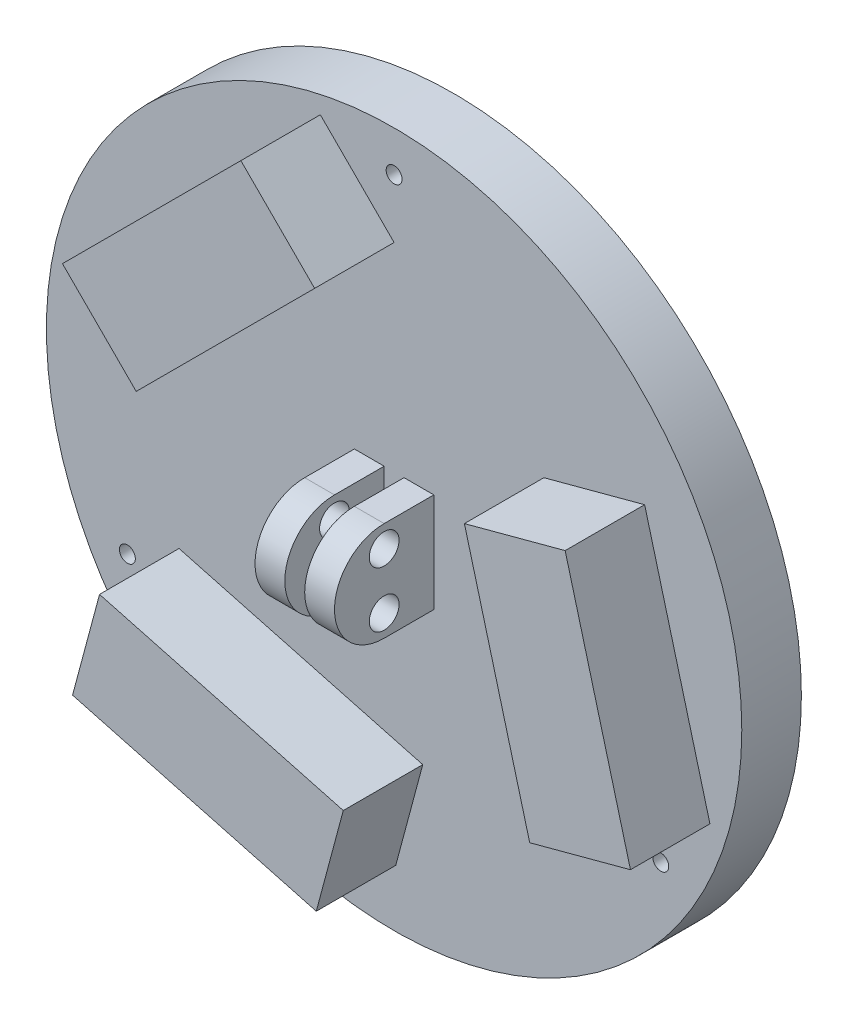
ISO-10303-21;
HEADER;
FILE_DESCRIPTION(('STEP AP214'),'2;1');
FILE_NAME('part.step','',(''),(''),'','','');
FILE_SCHEMA(('AUTOMOTIVE_DESIGN { 1 0 10303 214 1 1 1 1 }'));
ENDSEC;
DATA;
#1=APPLICATION_CONTEXT('core data for automotive mechanical design processes');
#2=APPLICATION_PROTOCOL_DEFINITION('international standard','automotive_design',2000,#1);
#3=PRODUCT_CONTEXT('',#1,'mechanical');
#4=PRODUCT('Part','Part','',(#3));
#5=PRODUCT_RELATED_PRODUCT_CATEGORY('part','',(#4));
#6=PRODUCT_DEFINITION_FORMATION('','',#4);
#7=PRODUCT_DEFINITION_CONTEXT('part definition',#1,'design');
#8=PRODUCT_DEFINITION('design','',#6,#7);
#9=PRODUCT_DEFINITION_SHAPE('','',#8);
#10=(LENGTH_UNIT() NAMED_UNIT(*) SI_UNIT(.MILLI.,.METRE.));
#11=(NAMED_UNIT(*) PLANE_ANGLE_UNIT() SI_UNIT($,.RADIAN.));
#12=(NAMED_UNIT(*) SI_UNIT($,.STERADIAN.) SOLID_ANGLE_UNIT());
#13=UNCERTAINTY_MEASURE_WITH_UNIT(LENGTH_MEASURE(1.E-05),#10,'distance_accuracy_value','');
#14=(GEOMETRIC_REPRESENTATION_CONTEXT(3) GLOBAL_UNCERTAINTY_ASSIGNED_CONTEXT((#13)) GLOBAL_UNIT_ASSIGNED_CONTEXT((#10,
#11,#12)) REPRESENTATION_CONTEXT('',''));
#15=CARTESIAN_POINT('',(0.,0.,0.));
#16=DIRECTION('',(0.,0.,1.));
#17=DIRECTION('',(1.,0.,0.));
#18=AXIS2_PLACEMENT_3D('',#15,#16,#17);
#19=CARTESIAN_POINT('',(0.,0.,6.));
#20=DIRECTION('',(0.,0.,1.));
#21=DIRECTION('',(1.,0.,0.));
#22=AXIS2_PLACEMENT_3D('',#19,#20,#21);
#23=PLANE('',#22);
#24=CARTESIAN_POINT('',(0.,0.,6.));
#25=DIRECTION('',(0.,0.,1.));
#26=DIRECTION('',(1.,0.,0.));
#27=AXIS2_PLACEMENT_3D('',#24,#25,#26);
#28=CIRCLE('',#27,0.6);
#29=CARTESIAN_POINT('',(0.6,0.,6.));
#30=VERTEX_POINT('',#29);
#31=EDGE_CURVE('E430',#30,#30,#28,.T.);
#32=ORIENTED_EDGE('',*,*,#31,.F.);
#33=EDGE_LOOP('',(#32));
#34=FACE_BOUND('',#33,.T.);
#35=CARTESIAN_POINT('',(1.34704405012329E-12,30.9142781849874,6.));
#36=DIRECTION('',(0.,0.,1.));
#37=DIRECTION('',(1.,0.,0.));
#38=AXIS2_PLACEMENT_3D('',#35,#36,#37);
#39=CIRCLE('',#38,0.799999999999999);
#40=CARTESIAN_POINT('',(0.800000000001346,30.9142781849874,6.));
#41=VERTEX_POINT('',#40);
#42=EDGE_CURVE('E443',#41,#41,#39,.T.);
#43=ORIENTED_EDGE('',*,*,#42,.F.);
#44=EDGE_LOOP('',(#43));
#45=FACE_BOUND('',#44,.T.);
#46=CARTESIAN_POINT('',(26.8467875173189,-15.5857218150126,6.));
#47=DIRECTION('',(0.,0.,1.));
#48=DIRECTION('',(1.,0.,0.));
#49=AXIS2_PLACEMENT_3D('',#46,#47,#48);
#50=CIRCLE('',#49,0.799999999999999);
#51=CARTESIAN_POINT('',(27.6467875173189,-15.5857218150126,6.));
#52=VERTEX_POINT('',#51);
#53=EDGE_CURVE('E447',#52,#52,#50,.T.);
#54=ORIENTED_EDGE('',*,*,#53,.F.);
#55=EDGE_LOOP('',(#54));
#56=FACE_BOUND('',#55,.T.);
#57=CARTESIAN_POINT('',(-26.8467875173163,-15.5857218150126,6.));
#58=DIRECTION('',(0.,0.,1.));
#59=DIRECTION('',(1.,0.,0.));
#60=AXIS2_PLACEMENT_3D('',#57,#58,#59);
#61=CIRCLE('',#60,0.799999999999999);
#62=CARTESIAN_POINT('',(-26.0467875173163,-15.5857218150126,6.));
#63=VERTEX_POINT('',#62);
#64=EDGE_CURVE('E455',#63,#63,#61,.T.);
#65=ORIENTED_EDGE('',*,*,#64,.F.);
#66=EDGE_LOOP('',(#65));
#67=FACE_BOUND('',#66,.T.);
#68=CARTESIAN_POINT('',(0.,0.,6.));
#69=DIRECTION('',(0.,0.,1.));
#70=DIRECTION('',(1.,0.,0.));
#71=AXIS2_PLACEMENT_3D('',#68,#69,#70);
#72=CIRCLE('',#71,35.);
#73=CARTESIAN_POINT('',(35.,0.,6.));
#74=VERTEX_POINT('',#73);
#75=EDGE_CURVE('E12',#74,#74,#72,.T.);
#76=ORIENTED_EDGE('',*,*,#75,.T.);
#77=EDGE_LOOP('',(#76));
#78=FACE_BOUND('',#77,.T.);
#79=DIRECTION('',(1.,0.,0.));
#80=VECTOR('',#79,1.);
#81=CARTESIAN_POINT('',(1.,-5.,6.));
#82=LINE('',#81,#80);
#83=CARTESIAN_POINT('',(1.,-5.,6.));
#84=VERTEX_POINT('',#83);
#85=CARTESIAN_POINT('',(4.,-5.,6.));
#86=VERTEX_POINT('',#85);
#87=EDGE_CURVE('E406',#84,#86,#82,.T.);
#88=ORIENTED_EDGE('',*,*,#87,.F.);
#89=DIRECTION('',(0.,-1.,0.));
#90=VECTOR('',#89,1.);
#91=CARTESIAN_POINT('',(0.999999999999999,5.,6.));
#92=LINE('',#91,#90);
#93=CARTESIAN_POINT('',(0.999999999999999,5.,6.));
#94=VERTEX_POINT('',#93);
#95=EDGE_CURVE('E402',#94,#84,#92,.T.);
#96=ORIENTED_EDGE('',*,*,#95,.F.);
#97=DIRECTION('',(-1.,0.,0.));
#98=VECTOR('',#97,1.);
#99=CARTESIAN_POINT('',(0.999999999999999,5.,6.));
#100=LINE('',#99,#98);
#101=CARTESIAN_POINT('',(4.,5.,6.));
#102=VERTEX_POINT('',#101);
#103=EDGE_CURVE('E414',#102,#94,#100,.T.);
#104=ORIENTED_EDGE('',*,*,#103,.F.);
#105=DIRECTION('',(0.,1.,0.));
#106=VECTOR('',#105,1.);
#107=CARTESIAN_POINT('',(4.,5.,6.));
#108=LINE('',#107,#106);
#109=EDGE_CURVE('E410',#86,#102,#108,.T.);
#110=ORIENTED_EDGE('',*,*,#109,.F.);
#111=EDGE_LOOP('',(#88,#96,#104,#110));
#112=FACE_BOUND('',#111,.T.);
#113=DIRECTION('',(-1.,0.,0.));
#114=VECTOR('',#113,1.);
#115=CARTESIAN_POINT('',(-1.,5.,6.));
#116=LINE('',#115,#114);
#117=CARTESIAN_POINT('',(-1.,5.,6.));
#118=VERTEX_POINT('',#117);
#119=CARTESIAN_POINT('',(-4.,5.,6.));
#120=VERTEX_POINT('',#119);
#121=EDGE_CURVE('E394',#118,#120,#116,.T.);
#122=ORIENTED_EDGE('',*,*,#121,.F.);
#123=DIRECTION('',(0.,1.,0.));
#124=VECTOR('',#123,1.);
#125=CARTESIAN_POINT('',(-1.,5.,6.));
#126=LINE('',#125,#124);
#127=CARTESIAN_POINT('',(-0.999999999999999,-5.,6.));
#128=VERTEX_POINT('',#127);
#129=EDGE_CURVE('E398',#128,#118,#126,.T.);
#130=ORIENTED_EDGE('',*,*,#129,.F.);
#131=DIRECTION('',(1.,0.,0.));
#132=VECTOR('',#131,1.);
#133=CARTESIAN_POINT('',(-0.999999999999999,-5.,6.));
#134=LINE('',#133,#132);
#135=CARTESIAN_POINT('',(-4.,-5.,6.));
#136=VERTEX_POINT('',#135);
#137=EDGE_CURVE('E386',#136,#128,#134,.T.);
#138=ORIENTED_EDGE('',*,*,#137,.F.);
#139=DIRECTION('',(0.,-1.,0.));
#140=VECTOR('',#139,1.);
#141=CARTESIAN_POINT('',(-4.,5.,6.));
#142=LINE('',#141,#140);
#143=EDGE_CURVE('E390',#120,#136,#142,.T.);
#144=ORIENTED_EDGE('',*,*,#143,.F.);
#145=EDGE_LOOP('',(#122,#130,#138,#144));
#146=FACE_BOUND('',#145,.T.);
#147=DIRECTION('',(0.707106781186544,-0.707106781186552,0.));
#148=VECTOR('',#147,1.);
#149=CARTESIAN_POINT('',(-25.3851334445971,14.4641089603206,6.));
#150=LINE('',#149,#148);
#151=CARTESIAN_POINT('',(-25.3851334445971,14.4641089603206,6.));
#152=VERTEX_POINT('',#151);
#153=CARTESIAN_POINT('',(-17.9605122421384,7.03948775786179,6.));
#154=VERTEX_POINT('',#153);
#155=EDGE_CURVE('E303',#152,#154,#150,.T.);
#156=ORIENTED_EDGE('',*,*,#155,.F.);
#157=DIRECTION('',(-0.707106781186562,-0.707106781186533,0.));
#158=VECTOR('',#157,1.);
#159=CARTESIAN_POINT('',(-7.42462120245843,32.4246212024585,6.));
#160=LINE('',#159,#158);
#161=CARTESIAN_POINT('',(-7.42462120245843,32.4246212024585,6.));
#162=VERTEX_POINT('',#161);
#163=EDGE_CURVE('E273',#162,#152,#160,.T.);
#164=ORIENTED_EDGE('',*,*,#163,.F.);
#165=DIRECTION('',(-0.707106781186544,0.707106781186552,0.));
#166=VECTOR('',#165,1.);
#167=CARTESIAN_POINT('',(-7.42462120245843,32.4246212024585,6.));
#168=LINE('',#167,#166);
#169=CARTESIAN_POINT('',(0.,25.,6.));
#170=VERTEX_POINT('',#169);
#171=EDGE_CURVE('E290',#170,#162,#168,.T.);
#172=ORIENTED_EDGE('',*,*,#171,.F.);
#173=DIRECTION('',(0.707106781186551,0.707106781186544,0.));
#174=VECTOR('',#173,1.);
#175=CARTESIAN_POINT('',(0.,25.,6.));
#176=LINE('',#175,#174);
#177=EDGE_CURVE('E306',#154,#170,#176,.T.);
#178=ORIENTED_EDGE('',*,*,#177,.F.);
#179=EDGE_LOOP('',(#156,#164,#172,#178));
#180=FACE_BOUND('',#179,.T.);
#181=DIRECTION('',(-0.96592582628907,-0.258819045102516,0.));
#182=VECTOR('',#181,1.);
#183=CARTESIAN_POINT('',(25.2188525250422,14.7521159613199,6.));
#184=LINE('',#183,#182);
#185=CARTESIAN_POINT('',(25.2188525250422,14.7521159613199,6.));
#186=VERTEX_POINT('',#185);
#187=CARTESIAN_POINT('',(15.076631349007,12.0345159877435,6.));
#188=VERTEX_POINT('',#187);
#189=EDGE_CURVE('E266',#186,#188,#184,.T.);
#190=ORIENTED_EDGE('',*,*,#189,.F.);
#191=DIRECTION('',(-0.258819045102516,0.96592582628907,0.));
#192=VECTOR('',#191,1.);
#193=CARTESIAN_POINT('',(31.7928562706461,-9.78240002642246,6.));
#194=LINE('',#193,#192);
#195=CARTESIAN_POINT('',(31.7928562706461,-9.78240002642246,6.));
#196=VERTEX_POINT('',#195);
#197=EDGE_CURVE('E269',#196,#186,#194,.T.);
#198=ORIENTED_EDGE('',*,*,#197,.F.);
#199=DIRECTION('',(0.96592582628907,0.258819045102515,0.));
#200=VECTOR('',#199,1.);
#201=CARTESIAN_POINT('',(31.7928562706461,-9.78240002642246,6.));
#202=LINE('',#201,#200);
#203=CARTESIAN_POINT('',(21.6506350946109,-12.4999999999989,6.));
#204=VERTEX_POINT('',#203);
#205=EDGE_CURVE('E259',#204,#196,#202,.T.);
#206=ORIENTED_EDGE('',*,*,#205,.F.);
#207=DIRECTION('',(0.258819045102516,-0.96592582628907,0.));
#208=VECTOR('',#207,1.);
#209=CARTESIAN_POINT('',(21.6506350946109,-12.4999999999989,6.));
#210=LINE('',#209,#208);
#211=EDGE_CURVE('E262',#188,#204,#210,.T.);
#212=ORIENTED_EDGE('',*,*,#211,.F.);
#213=EDGE_LOOP('',(#190,#198,#206,#212));
#214=FACE_BOUND('',#213,.T.);
#215=DIRECTION('',(0.258819045102526,0.965925826289067,0.));
#216=VECTOR('',#215,1.);
#217=CARTESIAN_POINT('',(0.166280919555753,-29.2162249216387,6.));
#218=LINE('',#217,#216);
#219=CARTESIAN_POINT('',(0.166280919555753,-29.2162249216387,6.));
#220=VERTEX_POINT('',#219);
#221=CARTESIAN_POINT('',(2.88388089313227,-19.0740037456035,6.));
#222=VERTEX_POINT('',#221);
#223=EDGE_CURVE('E228',#220,#222,#218,.T.);
#224=ORIENTED_EDGE('',*,*,#223,.F.);
#225=DIRECTION('',(0.965925826289067,-0.258819045102525,0.));
#226=VECTOR('',#225,1.);
#227=CARTESIAN_POINT('',(-24.3682350681866,-22.6422211760346,6.));
#228=LINE('',#227,#226);
#229=CARTESIAN_POINT('',(-24.3682350681866,-22.6422211760346,6.));
#230=VERTEX_POINT('',#229);
#231=EDGE_CURVE('E222',#230,#220,#228,.T.);
#232=ORIENTED_EDGE('',*,*,#231,.F.);
#233=DIRECTION('',(-0.258819045102526,-0.965925826289067,0.));
#234=VECTOR('',#233,1.);
#235=CARTESIAN_POINT('',(-24.3682350681866,-22.6422211760346,6.));
#236=LINE('',#235,#234);
#237=CARTESIAN_POINT('',(-21.65063509461,-12.4999999999994,6.));
#238=VERTEX_POINT('',#237);
#239=EDGE_CURVE('E206',#238,#230,#236,.T.);
#240=ORIENTED_EDGE('',*,*,#239,.F.);
#241=DIRECTION('',(-0.965925826289067,0.258819045102526,0.));
#242=VECTOR('',#241,1.);
#243=CARTESIAN_POINT('',(-21.65063509461,-12.4999999999994,6.));
#244=LINE('',#243,#242);
#245=EDGE_CURVE('E215',#222,#238,#244,.T.);
#246=ORIENTED_EDGE('',*,*,#245,.F.);
#247=EDGE_LOOP('',(#224,#232,#240,#246));
#248=FACE_BOUND('',#247,.T.);
#249=ADVANCED_FACE('F65',(#34,#45,#56,#67,#78,#112,#146,#180,#214,#248),#23,.T.);
#250=CARTESIAN_POINT('',(0.999999999999999,5.,16.));
#251=DIRECTION('',(1.,0.,0.));
#252=DIRECTION('',(0.,1.,0.));
#253=AXIS2_PLACEMENT_3D('',#250,#251,#252);
#254=PLANE('',#253);
#255=CARTESIAN_POINT('',(1.,2.8,11.));
#256=DIRECTION('',(1.,0.,0.));
#257=DIRECTION('',(0.,1.,0.));
#258=AXIS2_PLACEMENT_3D('',#255,#256,#257);
#259=CIRCLE('',#258,1.5);
#260=CARTESIAN_POINT('',(1.,4.3,11.));
#261=VERTEX_POINT('',#260);
#262=EDGE_CURVE('E346',#261,#261,#259,.T.);
#263=ORIENTED_EDGE('',*,*,#262,.T.);
#264=EDGE_LOOP('',(#263));
#265=FACE_BOUND('',#264,.T.);
#266=CARTESIAN_POINT('',(1.,-2.8,11.));
#267=DIRECTION('',(1.,0.,0.));
#268=DIRECTION('',(0.,1.,0.));
#269=AXIS2_PLACEMENT_3D('',#266,#267,#268);
#270=CIRCLE('',#269,1.5);
#271=CARTESIAN_POINT('',(1.,-1.3,11.));
#272=VERTEX_POINT('',#271);
#273=EDGE_CURVE('E338',#272,#272,#270,.T.);
#274=ORIENTED_EDGE('',*,*,#273,.T.);
#275=EDGE_LOOP('',(#274));
#276=FACE_BOUND('',#275,.T.);
#277=DIRECTION('',(0.,0.,-1.));
#278=VECTOR('',#277,1.);
#279=CARTESIAN_POINT('',(1.,-5.,16.));
#280=LINE('',#279,#278);
#281=CARTESIAN_POINT('',(1.,-5.,11.));
#282=VERTEX_POINT('',#281);
#283=EDGE_CURVE('E427',#282,#84,#280,.T.);
#284=ORIENTED_EDGE('',*,*,#283,.F.);
#285=CARTESIAN_POINT('',(1.,0.,11.));
#286=DIRECTION('',(1.,0.,0.));
#287=DIRECTION('',(0.,1.,0.));
#288=AXIS2_PLACEMENT_3D('',#285,#286,#287);
#289=CIRCLE('',#288,5.);
#290=CARTESIAN_POINT('',(1.,5.,11.));
#291=VERTEX_POINT('',#290);
#292=EDGE_CURVE('E370',#282,#291,#289,.F.);
#293=ORIENTED_EDGE('',*,*,#292,.T.);
#294=DIRECTION('',(0.,0.,-1.));
#295=VECTOR('',#294,1.);
#296=CARTESIAN_POINT('',(0.999999999999999,5.,16.));
#297=LINE('',#296,#295);
#298=EDGE_CURVE('E418',#291,#94,#297,.T.);
#299=ORIENTED_EDGE('',*,*,#298,.T.);
#300=ORIENTED_EDGE('',*,*,#95,.T.);
#301=EDGE_LOOP('',(#284,#293,#299,#300));
#302=FACE_BOUND('',#301,.T.);
#303=ADVANCED_FACE('F526',(#265,#276,#302),#254,.F.);
#304=CARTESIAN_POINT('',(4.,5.,16.));
#305=DIRECTION('',(-1.,0.,0.));
#306=DIRECTION('',(0.,-1.,0.));
#307=AXIS2_PLACEMENT_3D('',#304,#305,#306);
#308=PLANE('',#307);
#309=CARTESIAN_POINT('',(4.,2.8,11.));
#310=DIRECTION('',(1.,0.,0.));
#311=DIRECTION('',(0.,1.,0.));
#312=AXIS2_PLACEMENT_3D('',#309,#310,#311);
#313=CIRCLE('',#312,1.5);
#314=CARTESIAN_POINT('',(4.,4.3,11.));
#315=VERTEX_POINT('',#314);
#316=EDGE_CURVE('E326',#315,#315,#313,.T.);
#317=ORIENTED_EDGE('',*,*,#316,.F.);
#318=EDGE_LOOP('',(#317));
#319=FACE_BOUND('',#318,.T.);
#320=CARTESIAN_POINT('',(4.,-2.8,11.));
#321=DIRECTION('',(1.,0.,0.));
#322=DIRECTION('',(0.,1.,0.));
#323=AXIS2_PLACEMENT_3D('',#320,#321,#322);
#324=CIRCLE('',#323,1.5);
#325=CARTESIAN_POINT('',(4.,-1.3,11.));
#326=VERTEX_POINT('',#325);
#327=EDGE_CURVE('E325',#326,#326,#324,.T.);
#328=ORIENTED_EDGE('',*,*,#327,.F.);
#329=EDGE_LOOP('',(#328));
#330=FACE_BOUND('',#329,.T.);
#331=CARTESIAN_POINT('',(4.,0.,11.));
#332=DIRECTION('',(1.,0.,0.));
#333=DIRECTION('',(0.,1.,0.));
#334=AXIS2_PLACEMENT_3D('',#331,#332,#333);
#335=CIRCLE('',#334,5.);
#336=CARTESIAN_POINT('',(4.,-5.,11.));
#337=VERTEX_POINT('',#336);
#338=CARTESIAN_POINT('',(4.,5.,11.));
#339=VERTEX_POINT('',#338);
#340=EDGE_CURVE('E355',#337,#339,#335,.F.);
#341=ORIENTED_EDGE('',*,*,#340,.F.);
#342=DIRECTION('',(0.,0.,-1.));
#343=VECTOR('',#342,1.);
#344=CARTESIAN_POINT('',(4.,-5.,16.));
#345=LINE('',#344,#343);
#346=EDGE_CURVE('E424',#337,#86,#345,.T.);
#347=ORIENTED_EDGE('',*,*,#346,.T.);
#348=ORIENTED_EDGE('',*,*,#109,.T.);
#349=DIRECTION('',(0.,0.,-1.));
#350=VECTOR('',#349,1.);
#351=CARTESIAN_POINT('',(4.,5.,16.));
#352=LINE('',#351,#350);
#353=EDGE_CURVE('E421',#339,#102,#352,.T.);
#354=ORIENTED_EDGE('',*,*,#353,.F.);
#355=EDGE_LOOP('',(#341,#347,#348,#354));
#356=FACE_BOUND('',#355,.T.);
#357=ADVANCED_FACE('F483',(#319,#330,#356),#308,.F.);
#358=CARTESIAN_POINT('',(-1.,5.,16.));
#359=DIRECTION('',(-1.,0.,0.));
#360=DIRECTION('',(0.,-1.,0.));
#361=AXIS2_PLACEMENT_3D('',#358,#359,#360);
#362=PLANE('',#361);
#363=CARTESIAN_POINT('',(-1.,2.8,11.));
#364=DIRECTION('',(-1.,0.,0.));
#365=DIRECTION('',(0.,-1.,0.));
#366=AXIS2_PLACEMENT_3D('',#363,#364,#365);
#367=CIRCLE('',#366,1.5);
#368=CARTESIAN_POINT('',(-1.,1.3,11.));
#369=VERTEX_POINT('',#368);
#370=EDGE_CURVE('E342',#369,#369,#367,.T.);
#371=ORIENTED_EDGE('',*,*,#370,.T.);
#372=EDGE_LOOP('',(#371));
#373=FACE_BOUND('',#372,.T.);
#374=CARTESIAN_POINT('',(-1.,-2.8,11.));
#375=DIRECTION('',(-1.,0.,0.));
#376=DIRECTION('',(0.,-1.,0.));
#377=AXIS2_PLACEMENT_3D('',#374,#375,#376);
#378=CIRCLE('',#377,1.5);
#379=CARTESIAN_POINT('',(-1.,-4.3,11.));
#380=VERTEX_POINT('',#379);
#381=EDGE_CURVE('E334',#380,#380,#378,.T.);
#382=ORIENTED_EDGE('',*,*,#381,.T.);
#383=EDGE_LOOP('',(#382));
#384=FACE_BOUND('',#383,.T.);
#385=CARTESIAN_POINT('',(-1.,0.,11.));
#386=DIRECTION('',(-1.,0.,0.));
#387=DIRECTION('',(0.,-1.,0.));
#388=AXIS2_PLACEMENT_3D('',#385,#386,#387);
#389=CIRCLE('',#388,5.);
#390=CARTESIAN_POINT('',(-1.,5.,11.));
#391=VERTEX_POINT('',#390);
#392=CARTESIAN_POINT('',(-1.,-5.,11.));
#393=VERTEX_POINT('',#392);
#394=EDGE_CURVE('E367',#391,#393,#389,.F.);
#395=ORIENTED_EDGE('',*,*,#394,.T.);
#396=DIRECTION('',(0.,0.,-1.));
#397=VECTOR('',#396,1.);
#398=CARTESIAN_POINT('',(-0.999999999999999,-5.,16.));
#399=LINE('',#398,#397);
#400=EDGE_CURVE('E383',#393,#128,#399,.T.);
#401=ORIENTED_EDGE('',*,*,#400,.T.);
#402=ORIENTED_EDGE('',*,*,#129,.T.);
#403=DIRECTION('',(0.,0.,-1.));
#404=VECTOR('',#403,1.);
#405=CARTESIAN_POINT('',(-1.,5.,16.));
#406=LINE('',#405,#404);
#407=EDGE_CURVE('E374',#391,#118,#406,.T.);
#408=ORIENTED_EDGE('',*,*,#407,.F.);
#409=EDGE_LOOP('',(#395,#401,#402,#408));
#410=FACE_BOUND('',#409,.T.);
#411=ADVANCED_FACE('F480',(#373,#384,#410),#362,.F.);
#412=CARTESIAN_POINT('',(-4.,5.,16.));
#413=DIRECTION('',(1.,0.,0.));
#414=DIRECTION('',(0.,1.,0.));
#415=AXIS2_PLACEMENT_3D('',#412,#413,#414);
#416=PLANE('',#415);
#417=CARTESIAN_POINT('',(-4.,2.8,11.));
#418=DIRECTION('',(1.,0.,0.));
#419=DIRECTION('',(0.,1.,0.));
#420=AXIS2_PLACEMENT_3D('',#417,#418,#419);
#421=CIRCLE('',#420,1.5);
#422=CARTESIAN_POINT('',(-4.,4.3,11.));
#423=VERTEX_POINT('',#422);
#424=EDGE_CURVE('E69',#423,#423,#421,.T.);
#425=ORIENTED_EDGE('',*,*,#424,.T.);
#426=EDGE_LOOP('',(#425));
#427=FACE_BOUND('',#426,.T.);
#428=CARTESIAN_POINT('',(-4.,-2.8,11.));
#429=DIRECTION('',(1.,0.,0.));
#430=DIRECTION('',(0.,1.,0.));
#431=AXIS2_PLACEMENT_3D('',#428,#429,#430);
#432=CIRCLE('',#431,1.5);
#433=CARTESIAN_POINT('',(-4.,-1.3,11.));
#434=VERTEX_POINT('',#433);
#435=EDGE_CURVE('E330',#434,#434,#432,.T.);
#436=ORIENTED_EDGE('',*,*,#435,.T.);
#437=EDGE_LOOP('',(#436));
#438=FACE_BOUND('',#437,.T.);
#439=DIRECTION('',(0.,0.,-1.));
#440=VECTOR('',#439,1.);
#441=CARTESIAN_POINT('',(-4.,-5.,16.));
#442=LINE('',#441,#440);
#443=CARTESIAN_POINT('',(-4.,-5.,11.));
#444=VERTEX_POINT('',#443);
#445=EDGE_CURVE('E380',#444,#136,#442,.T.);
#446=ORIENTED_EDGE('',*,*,#445,.F.);
#447=CARTESIAN_POINT('',(-4.,0.,11.));
#448=DIRECTION('',(1.,0.,0.));
#449=DIRECTION('',(0.,1.,0.));
#450=AXIS2_PLACEMENT_3D('',#447,#448,#449);
#451=CIRCLE('',#450,5.);
#452=CARTESIAN_POINT('',(-4.,5.,11.));
#453=VERTEX_POINT('',#452);
#454=EDGE_CURVE('E363',#444,#453,#451,.F.);
#455=ORIENTED_EDGE('',*,*,#454,.T.);
#456=DIRECTION('',(0.,0.,-1.));
#457=VECTOR('',#456,1.);
#458=CARTESIAN_POINT('',(-4.,5.,16.));
#459=LINE('',#458,#457);
#460=EDGE_CURVE('E377',#453,#120,#459,.T.);
#461=ORIENTED_EDGE('',*,*,#460,.T.);
#462=ORIENTED_EDGE('',*,*,#143,.T.);
#463=EDGE_LOOP('',(#446,#455,#461,#462));
#464=FACE_BOUND('',#463,.T.);
#465=ADVANCED_FACE('F468',(#427,#438,#464),#416,.F.);
#466=CARTESIAN_POINT('',(0.999999999999999,5.,16.));
#467=DIRECTION('',(0.,-1.,0.));
#468=DIRECTION('',(0.,0.,-1.));
#469=AXIS2_PLACEMENT_3D('',#466,#467,#468);
#470=PLANE('',#469);
#471=DIRECTION('',(1.,0.,0.));
#472=VECTOR('',#471,1.);
#473=CARTESIAN_POINT('',(-35.,4.99999999999999,11.));
#474=LINE('',#473,#472);
#475=EDGE_CURVE('E358',#291,#339,#474,.T.);
#476=ORIENTED_EDGE('',*,*,#475,.T.);
#477=ORIENTED_EDGE('',*,*,#353,.T.);
#478=ORIENTED_EDGE('',*,*,#103,.T.);
#479=ORIENTED_EDGE('',*,*,#298,.F.);
#480=EDGE_LOOP('',(#476,#477,#478,#479));
#481=FACE_BOUND('',#480,.T.);
#482=ADVANCED_FACE('F579',(#481),#470,.F.);
#483=CARTESIAN_POINT('',(-1.,5.,16.));
#484=DIRECTION('',(0.,-1.,0.));
#485=DIRECTION('',(0.,0.,-1.));
#486=AXIS2_PLACEMENT_3D('',#483,#484,#485);
#487=PLANE('',#486);
#488=EDGE_CURVE('E362',#453,#391,#474,.T.);
#489=ORIENTED_EDGE('',*,*,#488,.T.);
#490=ORIENTED_EDGE('',*,*,#407,.T.);
#491=ORIENTED_EDGE('',*,*,#121,.T.);
#492=ORIENTED_EDGE('',*,*,#460,.F.);
#493=EDGE_LOOP('',(#489,#490,#491,#492));
#494=FACE_BOUND('',#493,.T.);
#495=ADVANCED_FACE('F505',(#494),#487,.F.);
#496=CARTESIAN_POINT('',(0.,0.,6.));
#497=DIRECTION('',(0.,0.,-1.));
#498=DIRECTION('',(-1.,0.,0.));
#499=AXIS2_PLACEMENT_3D('',#496,#497,#498);
#500=CYLINDRICAL_SURFACE('',#499,35.);
#501=ORIENTED_EDGE('',*,*,#75,.F.);
#502=EDGE_LOOP('',(#501));
#503=FACE_BOUND('',#502,.T.);
#504=CARTESIAN_POINT('',(0.,0.,0.));
#505=DIRECTION('',(0.,0.,1.));
#506=DIRECTION('',(1.,0.,0.));
#507=AXIS2_PLACEMENT_3D('',#504,#505,#506);
#508=CIRCLE('',#507,35.);
#509=CARTESIAN_POINT('',(35.,0.,0.));
#510=VERTEX_POINT('',#509);
#511=EDGE_CURVE('E75',#510,#510,#508,.T.);
#512=ORIENTED_EDGE('',*,*,#511,.T.);
#513=EDGE_LOOP('',(#512));
#514=FACE_BOUND('',#513,.T.);
#515=ADVANCED_FACE('F67',(#503,#514),#500,.T.);
#516=CARTESIAN_POINT('',(0.,0.,0.));
#517=DIRECTION('',(0.,0.,1.));
#518=DIRECTION('',(1.,0.,0.));
#519=AXIS2_PLACEMENT_3D('',#516,#517,#518);
#520=PLANE('',#519);
#521=CARTESIAN_POINT('',(0.,0.,0.));
#522=DIRECTION('',(0.,0.,1.));
#523=DIRECTION('',(1.,0.,0.));
#524=AXIS2_PLACEMENT_3D('',#521,#522,#523);
#525=CIRCLE('',#524,0.6);
#526=CARTESIAN_POINT('',(0.6,0.,0.));
#527=VERTEX_POINT('',#526);
#528=EDGE_CURVE('E431',#527,#527,#525,.T.);
#529=ORIENTED_EDGE('',*,*,#528,.T.);
#530=EDGE_LOOP('',(#529));
#531=FACE_BOUND('',#530,.T.);
#532=CARTESIAN_POINT('',(1.34704405012329E-12,30.9142781849874,0.));
#533=DIRECTION('',(0.,0.,1.));
#534=DIRECTION('',(1.,0.,0.));
#535=AXIS2_PLACEMENT_3D('',#532,#533,#534);
#536=CIRCLE('',#535,0.799999999999999);
#537=CARTESIAN_POINT('',(0.800000000001346,30.9142781849874,0.));
#538=VERTEX_POINT('',#537);
#539=EDGE_CURVE('E439',#538,#538,#536,.T.);
#540=ORIENTED_EDGE('',*,*,#539,.T.);
#541=EDGE_LOOP('',(#540));
#542=FACE_BOUND('',#541,.T.);
#543=CARTESIAN_POINT('',(26.8467875173189,-15.5857218150126,0.));
#544=DIRECTION('',(0.,0.,1.));
#545=DIRECTION('',(1.,0.,0.));
#546=AXIS2_PLACEMENT_3D('',#543,#544,#545);
#547=CIRCLE('',#546,0.799999999999999);
#548=CARTESIAN_POINT('',(27.6467875173189,-15.5857218150126,0.));
#549=VERTEX_POINT('',#548);
#550=EDGE_CURVE('E451',#549,#549,#547,.T.);
#551=ORIENTED_EDGE('',*,*,#550,.T.);
#552=EDGE_LOOP('',(#551));
#553=FACE_BOUND('',#552,.T.);
#554=CARTESIAN_POINT('',(-26.8467875173163,-15.5857218150126,0.));
#555=DIRECTION('',(0.,0.,1.));
#556=DIRECTION('',(1.,0.,0.));
#557=AXIS2_PLACEMENT_3D('',#554,#555,#556);
#558=CIRCLE('',#557,0.799999999999999);
#559=CARTESIAN_POINT('',(-26.0467875173163,-15.5857218150126,0.));
#560=VERTEX_POINT('',#559);
#561=EDGE_CURVE('E435',#560,#560,#558,.T.);
#562=ORIENTED_EDGE('',*,*,#561,.T.);
#563=EDGE_LOOP('',(#562));
#564=FACE_BOUND('',#563,.T.);
#565=ORIENTED_EDGE('',*,*,#511,.F.);
#566=EDGE_LOOP('',(#565));
#567=FACE_BOUND('',#566,.T.);
#568=ADVANCED_FACE('F541',(#531,#542,#553,#564,#567),#520,.F.);
#569=CARTESIAN_POINT('',(-26.8467875173163,-15.5857218150126,0.));
#570=DIRECTION('',(0.,0.,1.));
#571=DIRECTION('',(1.,0.,0.));
#572=AXIS2_PLACEMENT_3D('',#569,#570,#571);
#573=CYLINDRICAL_SURFACE('',#572,0.799999999999999);
#574=ORIENTED_EDGE('',*,*,#561,.F.);
#575=EDGE_LOOP('',(#574));
#576=FACE_BOUND('',#575,.T.);
#577=ORIENTED_EDGE('',*,*,#64,.T.);
#578=EDGE_LOOP('',(#577));
#579=FACE_BOUND('',#578,.T.);
#580=ADVANCED_FACE('F539',(#576,#579),#573,.F.);
#581=CARTESIAN_POINT('',(26.8467875173189,-15.5857218150126,0.));
#582=DIRECTION('',(0.,0.,1.));
#583=DIRECTION('',(1.,0.,0.));
#584=AXIS2_PLACEMENT_3D('',#581,#582,#583);
#585=CYLINDRICAL_SURFACE('',#584,0.799999999999999);
#586=ORIENTED_EDGE('',*,*,#550,.F.);
#587=EDGE_LOOP('',(#586));
#588=FACE_BOUND('',#587,.T.);
#589=ORIENTED_EDGE('',*,*,#53,.T.);
#590=EDGE_LOOP('',(#589));
#591=FACE_BOUND('',#590,.T.);
#592=ADVANCED_FACE('F548',(#588,#591),#585,.F.);
#593=CARTESIAN_POINT('',(1.34704405012329E-12,30.9142781849874,0.));
#594=DIRECTION('',(0.,0.,1.));
#595=DIRECTION('',(1.,0.,0.));
#596=AXIS2_PLACEMENT_3D('',#593,#594,#595);
#597=CYLINDRICAL_SURFACE('',#596,0.799999999999999);
#598=ORIENTED_EDGE('',*,*,#539,.F.);
#599=EDGE_LOOP('',(#598));
#600=FACE_BOUND('',#599,.T.);
#601=ORIENTED_EDGE('',*,*,#42,.T.);
#602=EDGE_LOOP('',(#601));
#603=FACE_BOUND('',#602,.T.);
#604=ADVANCED_FACE('F605',(#600,#603),#597,.F.);
#605=CARTESIAN_POINT('',(0.,0.,0.));
#606=DIRECTION('',(0.,0.,1.));
#607=DIRECTION('',(1.,0.,0.));
#608=AXIS2_PLACEMENT_3D('',#605,#606,#607);
#609=CYLINDRICAL_SURFACE('',#608,0.6);
#610=ORIENTED_EDGE('',*,*,#528,.F.);
#611=EDGE_LOOP('',(#610));
#612=FACE_BOUND('',#611,.T.);
#613=ORIENTED_EDGE('',*,*,#31,.T.);
#614=EDGE_LOOP('',(#613));
#615=FACE_BOUND('',#614,.T.);
#616=ADVANCED_FACE('F601',(#612,#615),#609,.F.);
#617=CARTESIAN_POINT('',(1.,-5.,16.));
#618=DIRECTION('',(0.,1.,0.));
#619=DIRECTION('',(-1.,0.,0.));
#620=AXIS2_PLACEMENT_3D('',#617,#618,#619);
#621=PLANE('',#620);
#622=ORIENTED_EDGE('',*,*,#346,.F.);
#623=DIRECTION('',(1.,0.,0.));
#624=VECTOR('',#623,1.);
#625=CARTESIAN_POINT('',(-35.,-5.00000000000001,11.));
#626=LINE('',#625,#624);
#627=EDGE_CURVE('E350',#282,#337,#626,.T.);
#628=ORIENTED_EDGE('',*,*,#627,.F.);
#629=ORIENTED_EDGE('',*,*,#283,.T.);
#630=ORIENTED_EDGE('',*,*,#87,.T.);
#631=EDGE_LOOP('',(#622,#628,#629,#630));
#632=FACE_BOUND('',#631,.T.);
#633=ADVANCED_FACE('F573',(#632),#621,.F.);
#634=CARTESIAN_POINT('',(-0.999999999999999,-5.,16.));
#635=DIRECTION('',(0.,1.,0.));
#636=DIRECTION('',(0.,0.,1.));
#637=AXIS2_PLACEMENT_3D('',#634,#635,#636);
#638=PLANE('',#637);
#639=ORIENTED_EDGE('',*,*,#400,.F.);
#640=EDGE_CURVE('E354',#444,#393,#626,.T.);
#641=ORIENTED_EDGE('',*,*,#640,.F.);
#642=ORIENTED_EDGE('',*,*,#445,.T.);
#643=ORIENTED_EDGE('',*,*,#137,.T.);
#644=EDGE_LOOP('',(#639,#641,#642,#643));
#645=FACE_BOUND('',#644,.T.);
#646=ADVANCED_FACE('F496',(#645),#638,.F.);
#647=CARTESIAN_POINT('',(-35.,0.,11.));
#648=DIRECTION('',(1.,0.,0.));
#649=DIRECTION('',(0.,1.,0.));
#650=AXIS2_PLACEMENT_3D('',#647,#648,#649);
#651=CYLINDRICAL_SURFACE('',#650,5.);
#652=ORIENTED_EDGE('',*,*,#488,.F.);
#653=ORIENTED_EDGE('',*,*,#454,.F.);
#654=ORIENTED_EDGE('',*,*,#640,.T.);
#655=ORIENTED_EDGE('',*,*,#394,.F.);
#656=EDGE_LOOP('',(#652,#653,#654,#655));
#657=FACE_BOUND('',#656,.T.);
#658=ADVANCED_FACE('F492',(#657),#651,.T.);
#659=ORIENTED_EDGE('',*,*,#292,.F.);
#660=ORIENTED_EDGE('',*,*,#627,.T.);
#661=ORIENTED_EDGE('',*,*,#340,.T.);
#662=ORIENTED_EDGE('',*,*,#475,.F.);
#663=EDGE_LOOP('',(#659,#660,#661,#662));
#664=FACE_BOUND('',#663,.T.);
#665=ADVANCED_FACE('F475',(#664),#651,.T.);
#666=CARTESIAN_POINT('',(-35.,-2.80000000000001,11.));
#667=DIRECTION('',(1.,0.,0.));
#668=DIRECTION('',(0.,1.,0.));
#669=AXIS2_PLACEMENT_3D('',#666,#667,#668);
#670=CYLINDRICAL_SURFACE('',#669,1.5);
#671=ORIENTED_EDGE('',*,*,#435,.F.);
#672=EDGE_LOOP('',(#671));
#673=FACE_BOUND('',#672,.T.);
#674=ORIENTED_EDGE('',*,*,#381,.F.);
#675=EDGE_LOOP('',(#674));
#676=FACE_BOUND('',#675,.T.);
#677=ADVANCED_FACE('F471',(#673,#676),#670,.F.);
#678=CARTESIAN_POINT('',(-35.,2.79999999999999,11.));
#679=DIRECTION('',(1.,0.,0.));
#680=DIRECTION('',(0.,1.,0.));
#681=AXIS2_PLACEMENT_3D('',#678,#679,#680);
#682=CYLINDRICAL_SURFACE('',#681,1.5);
#683=ORIENTED_EDGE('',*,*,#424,.F.);
#684=EDGE_LOOP('',(#683));
#685=FACE_BOUND('',#684,.T.);
#686=ORIENTED_EDGE('',*,*,#370,.F.);
#687=EDGE_LOOP('',(#686));
#688=FACE_BOUND('',#687,.T.);
#689=ADVANCED_FACE('F474',(#685,#688),#682,.F.);
#690=ORIENTED_EDGE('',*,*,#327,.T.);
#691=EDGE_LOOP('',(#690));
#692=FACE_BOUND('',#691,.T.);
#693=ORIENTED_EDGE('',*,*,#273,.F.);
#694=EDGE_LOOP('',(#693));
#695=FACE_BOUND('',#694,.T.);
#696=ADVANCED_FACE('F477',(#692,#695),#670,.F.);
#697=ORIENTED_EDGE('',*,*,#316,.T.);
#698=EDGE_LOOP('',(#697));
#699=FACE_BOUND('',#698,.T.);
#700=ORIENTED_EDGE('',*,*,#262,.F.);
#701=EDGE_LOOP('',(#700));
#702=FACE_BOUND('',#701,.T.);
#703=ADVANCED_FACE('F515',(#699,#702),#682,.F.);
#704=CARTESIAN_POINT('',(-7.42462120245843,32.4246212024585,14.));
#705=DIRECTION('',(0.707106781186533,-0.707106781186562,0.));
#706=DIRECTION('',(0.707106781186562,0.707106781186533,0.));
#707=AXIS2_PLACEMENT_3D('',#704,#705,#706);
#708=PLANE('',#707);
#709=ORIENTED_EDGE('',*,*,#163,.T.);
#710=DIRECTION('',(0.,0.,-1.));
#711=VECTOR('',#710,1.);
#712=CARTESIAN_POINT('',(-25.3851334445971,14.4641089603206,14.));
#713=LINE('',#712,#711);
#714=CARTESIAN_POINT('',(-25.3851334445971,14.4641089603206,14.));
#715=VERTEX_POINT('',#714);
#716=EDGE_CURVE('E322',#715,#152,#713,.T.);
#717=ORIENTED_EDGE('',*,*,#716,.F.);
#718=DIRECTION('',(-0.707106781186562,-0.707106781186533,0.));
#719=VECTOR('',#718,1.);
#720=CARTESIAN_POINT('',(-7.42462120245843,32.4246212024585,14.));
#721=LINE('',#720,#719);
#722=CARTESIAN_POINT('',(-7.42462120245843,32.4246212024585,14.));
#723=VERTEX_POINT('',#722);
#724=EDGE_CURVE('E285',#723,#715,#721,.T.);
#725=ORIENTED_EDGE('',*,*,#724,.F.);
#726=DIRECTION('',(0.,0.,-1.));
#727=VECTOR('',#726,1.);
#728=CARTESIAN_POINT('',(-7.42462120245843,32.4246212024585,14.));
#729=LINE('',#728,#727);
#730=EDGE_CURVE('E299',#723,#162,#729,.T.);
#731=ORIENTED_EDGE('',*,*,#730,.T.);
#732=EDGE_LOOP('',(#709,#717,#725,#731));
#733=FACE_BOUND('',#732,.T.);
#734=ADVANCED_FACE('F523',(#733),#708,.F.);
#735=CARTESIAN_POINT('',(-25.3851334445971,14.4641089603206,14.));
#736=DIRECTION('',(0.707106781186552,0.707106781186544,0.));
#737=DIRECTION('',(-0.707106781186544,0.707106781186552,0.));
#738=AXIS2_PLACEMENT_3D('',#735,#736,#737);
#739=PLANE('',#738);
#740=ORIENTED_EDGE('',*,*,#155,.T.);
#741=DIRECTION('',(0.,0.,-1.));
#742=VECTOR('',#741,1.);
#743=CARTESIAN_POINT('',(-17.9605122421384,7.03948775786179,14.));
#744=LINE('',#743,#742);
#745=CARTESIAN_POINT('',(-17.9605122421384,7.03948775786179,14.));
#746=VERTEX_POINT('',#745);
#747=EDGE_CURVE('E318',#746,#154,#744,.T.);
#748=ORIENTED_EDGE('',*,*,#747,.F.);
#749=DIRECTION('',(0.707106781186544,-0.707106781186552,0.));
#750=VECTOR('',#749,1.);
#751=CARTESIAN_POINT('',(-25.3851334445971,14.4641089603206,14.));
#752=LINE('',#751,#750);
#753=EDGE_CURVE('E289',#715,#746,#752,.T.);
#754=ORIENTED_EDGE('',*,*,#753,.F.);
#755=ORIENTED_EDGE('',*,*,#716,.T.);
#756=EDGE_LOOP('',(#740,#748,#754,#755));
#757=FACE_BOUND('',#756,.T.);
#758=ADVANCED_FACE('F713',(#757),#739,.F.);
#759=CARTESIAN_POINT('',(0.,25.,14.));
#760=DIRECTION('',(-0.707106781186544,0.707106781186551,0.));
#761=DIRECTION('',(-0.707106781186551,-0.707106781186544,0.));
#762=AXIS2_PLACEMENT_3D('',#759,#760,#761);
#763=PLANE('',#762);
#764=ORIENTED_EDGE('',*,*,#177,.T.);
#765=DIRECTION('',(0.,0.,-1.));
#766=VECTOR('',#765,1.);
#767=CARTESIAN_POINT('',(0.,25.,14.));
#768=LINE('',#767,#766);
#769=CARTESIAN_POINT('',(0.,25.,14.));
#770=VERTEX_POINT('',#769);
#771=EDGE_CURVE('E315',#770,#170,#768,.T.);
#772=ORIENTED_EDGE('',*,*,#771,.F.);
#773=DIRECTION('',(0.707106781186551,0.707106781186544,0.));
#774=VECTOR('',#773,1.);
#775=CARTESIAN_POINT('',(0.,25.,14.));
#776=LINE('',#775,#774);
#777=EDGE_CURVE('E293',#746,#770,#776,.T.);
#778=ORIENTED_EDGE('',*,*,#777,.F.);
#779=ORIENTED_EDGE('',*,*,#747,.T.);
#780=EDGE_LOOP('',(#764,#772,#778,#779));
#781=FACE_BOUND('',#780,.T.);
#782=ADVANCED_FACE('F719',(#781),#763,.F.);
#783=CARTESIAN_POINT('',(-7.42462120245843,32.4246212024585,14.));
#784=DIRECTION('',(-0.707106781186552,-0.707106781186544,0.));
#785=DIRECTION('',(0.707106781186544,-0.707106781186552,0.));
#786=AXIS2_PLACEMENT_3D('',#783,#784,#785);
#787=PLANE('',#786);
#788=ORIENTED_EDGE('',*,*,#171,.T.);
#789=ORIENTED_EDGE('',*,*,#730,.F.);
#790=DIRECTION('',(-0.707106781186544,0.707106781186552,0.));
#791=VECTOR('',#790,1.);
#792=CARTESIAN_POINT('',(-7.42462120245843,32.4246212024585,14.));
#793=LINE('',#792,#791);
#794=EDGE_CURVE('E296',#770,#723,#793,.T.);
#795=ORIENTED_EDGE('',*,*,#794,.F.);
#796=ORIENTED_EDGE('',*,*,#771,.T.);
#797=EDGE_LOOP('',(#788,#789,#795,#796));
#798=FACE_BOUND('',#797,.T.);
#799=ADVANCED_FACE('F727',(#798),#787,.F.);
#800=CARTESIAN_POINT('',(0.,0.,14.));
#801=DIRECTION('',(0.,0.,1.));
#802=DIRECTION('',(1.,0.,0.));
#803=AXIS2_PLACEMENT_3D('',#800,#801,#802);
#804=PLANE('',#803);
#805=ORIENTED_EDGE('',*,*,#724,.T.);
#806=ORIENTED_EDGE('',*,*,#753,.T.);
#807=ORIENTED_EDGE('',*,*,#777,.T.);
#808=ORIENTED_EDGE('',*,*,#794,.T.);
#809=EDGE_LOOP('',(#805,#806,#807,#808));
#810=FACE_BOUND('',#809,.T.);
#811=ADVANCED_FACE('F735',(#810),#804,.T.);
#812=CARTESIAN_POINT('',(31.7928562706461,-9.78240002642246,14.));
#813=DIRECTION('',(-0.96592582628907,-0.258819045102516,0.));
#814=DIRECTION('',(0.258819045102516,-0.96592582628907,0.));
#815=AXIS2_PLACEMENT_3D('',#812,#813,#814);
#816=PLANE('',#815);
#817=ORIENTED_EDGE('',*,*,#197,.T.);
#818=DIRECTION('',(0.,0.,-1.));
#819=VECTOR('',#818,1.);
#820=CARTESIAN_POINT('',(25.2188525250422,14.7521159613199,14.));
#821=LINE('',#820,#819);
#822=CARTESIAN_POINT('',(25.2188525250422,14.7521159613199,14.));
#823=VERTEX_POINT('',#822);
#824=EDGE_CURVE('E230',#823,#186,#821,.T.);
#825=ORIENTED_EDGE('',*,*,#824,.F.);
#826=DIRECTION('',(-0.258819045102516,0.96592582628907,0.));
#827=VECTOR('',#826,1.);
#828=CARTESIAN_POINT('',(31.7928562706461,-9.78240002642246,14.));
#829=LINE('',#828,#827);
#830=CARTESIAN_POINT('',(31.7928562706461,-9.78240002642246,14.));
#831=VERTEX_POINT('',#830);
#832=EDGE_CURVE('E263',#831,#823,#829,.T.);
#833=ORIENTED_EDGE('',*,*,#832,.F.);
#834=DIRECTION('',(0.,0.,-1.));
#835=VECTOR('',#834,1.);
#836=CARTESIAN_POINT('',(31.7928562706461,-9.78240002642246,14.));
#837=LINE('',#836,#835);
#838=EDGE_CURVE('E254',#831,#196,#837,.T.);
#839=ORIENTED_EDGE('',*,*,#838,.T.);
#840=EDGE_LOOP('',(#817,#825,#833,#839));
#841=FACE_BOUND('',#840,.T.);
#842=ADVANCED_FACE('F743',(#841),#816,.F.);
#843=CARTESIAN_POINT('',(25.2188525250422,14.7521159613199,14.));
#844=DIRECTION('',(0.258819045102516,-0.96592582628907,0.));
#845=DIRECTION('',(0.96592582628907,0.258819045102516,0.));
#846=AXIS2_PLACEMENT_3D('',#843,#844,#845);
#847=PLANE('',#846);
#848=ORIENTED_EDGE('',*,*,#189,.T.);
#849=DIRECTION('',(0.,0.,-1.));
#850=VECTOR('',#849,1.);
#851=CARTESIAN_POINT('',(15.076631349007,12.0345159877435,14.));
#852=LINE('',#851,#850);
#853=CARTESIAN_POINT('',(15.076631349007,12.0345159877435,14.));
#854=VERTEX_POINT('',#853);
#855=EDGE_CURVE('E234',#854,#188,#852,.T.);
#856=ORIENTED_EDGE('',*,*,#855,.F.);
#857=DIRECTION('',(-0.96592582628907,-0.258819045102516,0.));
#858=VECTOR('',#857,1.);
#859=CARTESIAN_POINT('',(25.2188525250422,14.7521159613199,14.));
#860=LINE('',#859,#858);
#861=EDGE_CURVE('E279',#823,#854,#860,.T.);
#862=ORIENTED_EDGE('',*,*,#861,.F.);
#863=ORIENTED_EDGE('',*,*,#824,.T.);
#864=EDGE_LOOP('',(#848,#856,#862,#863));
#865=FACE_BOUND('',#864,.T.);
#866=ADVANCED_FACE('F751',(#865),#847,.F.);
#867=CARTESIAN_POINT('',(21.6506350946109,-12.4999999999989,14.));
#868=DIRECTION('',(0.96592582628907,0.258819045102516,0.));
#869=DIRECTION('',(-0.258819045102516,0.96592582628907,0.));
#870=AXIS2_PLACEMENT_3D('',#867,#868,#869);
#871=PLANE('',#870);
#872=ORIENTED_EDGE('',*,*,#211,.T.);
#873=DIRECTION('',(0.,0.,-1.));
#874=VECTOR('',#873,1.);
#875=CARTESIAN_POINT('',(21.6506350946109,-12.4999999999989,14.));
#876=LINE('',#875,#874);
#877=CARTESIAN_POINT('',(21.6506350946109,-12.4999999999989,14.));
#878=VERTEX_POINT('',#877);
#879=EDGE_CURVE('E91',#878,#204,#876,.T.);
#880=ORIENTED_EDGE('',*,*,#879,.F.);
#881=DIRECTION('',(0.258819045102516,-0.96592582628907,0.));
#882=VECTOR('',#881,1.);
#883=CARTESIAN_POINT('',(21.6506350946109,-12.4999999999989,14.));
#884=LINE('',#883,#882);
#885=EDGE_CURVE('E276',#854,#878,#884,.T.);
#886=ORIENTED_EDGE('',*,*,#885,.F.);
#887=ORIENTED_EDGE('',*,*,#855,.T.);
#888=EDGE_LOOP('',(#872,#880,#886,#887));
#889=FACE_BOUND('',#888,.T.);
#890=ADVANCED_FACE('F759',(#889),#871,.F.);
#891=CARTESIAN_POINT('',(31.7928562706461,-9.78240002642246,14.));
#892=DIRECTION('',(-0.258819045102515,0.96592582628907,0.));
#893=DIRECTION('',(-0.96592582628907,-0.258819045102515,0.));
#894=AXIS2_PLACEMENT_3D('',#891,#892,#893);
#895=PLANE('',#894);
#896=ORIENTED_EDGE('',*,*,#205,.T.);
#897=ORIENTED_EDGE('',*,*,#838,.F.);
#898=DIRECTION('',(0.96592582628907,0.258819045102515,0.));
#899=VECTOR('',#898,1.);
#900=CARTESIAN_POINT('',(31.7928562706461,-9.78240002642246,14.));
#901=LINE('',#900,#899);
#902=EDGE_CURVE('E258',#878,#831,#901,.T.);
#903=ORIENTED_EDGE('',*,*,#902,.F.);
#904=ORIENTED_EDGE('',*,*,#879,.T.);
#905=EDGE_LOOP('',(#896,#897,#903,#904));
#906=FACE_BOUND('',#905,.T.);
#907=ADVANCED_FACE('F767',(#906),#895,.F.);
#908=CARTESIAN_POINT('',(0.,0.,14.));
#909=DIRECTION('',(0.,0.,1.));
#910=DIRECTION('',(1.,0.,0.));
#911=AXIS2_PLACEMENT_3D('',#908,#909,#910);
#912=PLANE('',#911);
#913=ORIENTED_EDGE('',*,*,#832,.T.);
#914=ORIENTED_EDGE('',*,*,#861,.T.);
#915=ORIENTED_EDGE('',*,*,#885,.T.);
#916=ORIENTED_EDGE('',*,*,#902,.T.);
#917=EDGE_LOOP('',(#913,#914,#915,#916));
#918=FACE_BOUND('',#917,.T.);
#919=ADVANCED_FACE('F775',(#918),#912,.T.);
#920=CARTESIAN_POINT('',(-24.3682350681866,-22.6422211760346,14.));
#921=DIRECTION('',(0.258819045102525,0.965925826289067,0.));
#922=DIRECTION('',(-0.965925826289067,0.258819045102525,0.));
#923=AXIS2_PLACEMENT_3D('',#920,#921,#922);
#924=PLANE('',#923);
#925=ORIENTED_EDGE('',*,*,#231,.T.);
#926=DIRECTION('',(0.,0.,-1.));
#927=VECTOR('',#926,1.);
#928=CARTESIAN_POINT('',(0.166280919555753,-29.2162249216387,14.));
#929=LINE('',#928,#927);
#930=CARTESIAN_POINT('',(0.166280919555753,-29.2162249216387,14.));
#931=VERTEX_POINT('',#930);
#932=EDGE_CURVE('E952',#931,#220,#929,.T.);
#933=ORIENTED_EDGE('',*,*,#932,.F.);
#934=DIRECTION('',(0.965925826289067,-0.258819045102525,0.));
#935=VECTOR('',#934,1.);
#936=CARTESIAN_POINT('',(-24.3682350681866,-22.6422211760346,14.));
#937=LINE('',#936,#935);
#938=CARTESIAN_POINT('',(-24.3682350681866,-22.6422211760346,14.));
#939=VERTEX_POINT('',#938);
#940=EDGE_CURVE('E216',#939,#931,#937,.T.);
#941=ORIENTED_EDGE('',*,*,#940,.F.);
#942=DIRECTION('',(0.,0.,-1.));
#943=VECTOR('',#942,1.);
#944=CARTESIAN_POINT('',(-24.3682350681866,-22.6422211760346,14.));
#945=LINE('',#944,#943);
#946=EDGE_CURVE('E209',#939,#230,#945,.T.);
#947=ORIENTED_EDGE('',*,*,#946,.T.);
#948=EDGE_LOOP('',(#925,#933,#941,#947));
#949=FACE_BOUND('',#948,.T.);
#950=ADVANCED_FACE('F220',(#949),#924,.F.);
#951=CARTESIAN_POINT('',(0.166280919555753,-29.2162249216387,14.));
#952=DIRECTION('',(-0.965925826289067,0.258819045102526,0.));
#953=DIRECTION('',(-0.258819045102526,-0.965925826289067,0.));
#954=AXIS2_PLACEMENT_3D('',#951,#952,#953);
#955=PLANE('',#954);
#956=ORIENTED_EDGE('',*,*,#223,.T.);
#957=DIRECTION('',(0.,0.,-1.));
#958=VECTOR('',#957,1.);
#959=CARTESIAN_POINT('',(2.88388089313227,-19.0740037456035,14.));
#960=LINE('',#959,#958);
#961=CARTESIAN_POINT('',(2.88388089313227,-19.0740037456035,14.));
#962=VERTEX_POINT('',#961);
#963=EDGE_CURVE('E954',#962,#222,#960,.T.);
#964=ORIENTED_EDGE('',*,*,#963,.F.);
#965=DIRECTION('',(0.258819045102526,0.965925826289067,0.));
#966=VECTOR('',#965,1.);
#967=CARTESIAN_POINT('',(0.166280919555753,-29.2162249216387,14.));
#968=LINE('',#967,#966);
#969=EDGE_CURVE('E244',#931,#962,#968,.T.);
#970=ORIENTED_EDGE('',*,*,#969,.F.);
#971=ORIENTED_EDGE('',*,*,#932,.T.);
#972=EDGE_LOOP('',(#956,#964,#970,#971));
#973=FACE_BOUND('',#972,.T.);
#974=ADVANCED_FACE('F789',(#973),#955,.F.);
#975=CARTESIAN_POINT('',(-21.65063509461,-12.4999999999994,14.));
#976=DIRECTION('',(-0.258819045102526,-0.965925826289067,0.));
#977=DIRECTION('',(0.965925826289067,-0.258819045102526,0.));
#978=AXIS2_PLACEMENT_3D('',#975,#976,#977);
#979=PLANE('',#978);
#980=ORIENTED_EDGE('',*,*,#245,.T.);
#981=DIRECTION('',(0.,0.,-1.));
#982=VECTOR('',#981,1.);
#983=CARTESIAN_POINT('',(-21.65063509461,-12.4999999999994,14.));
#984=LINE('',#983,#982);
#985=CARTESIAN_POINT('',(-21.65063509461,-12.4999999999994,14.));
#986=VERTEX_POINT('',#985);
#987=EDGE_CURVE('E83',#986,#238,#984,.T.);
#988=ORIENTED_EDGE('',*,*,#987,.F.);
#989=DIRECTION('',(-0.965925826289067,0.258819045102526,0.));
#990=VECTOR('',#989,1.);
#991=CARTESIAN_POINT('',(-21.65063509461,-12.4999999999994,14.));
#992=LINE('',#991,#990);
#993=EDGE_CURVE('E241',#962,#986,#992,.T.);
#994=ORIENTED_EDGE('',*,*,#993,.F.);
#995=ORIENTED_EDGE('',*,*,#963,.T.);
#996=EDGE_LOOP('',(#980,#988,#994,#995));
#997=FACE_BOUND('',#996,.T.);
#998=ADVANCED_FACE('F796',(#997),#979,.F.);
#999=CARTESIAN_POINT('',(-24.3682350681866,-22.6422211760346,14.));
#1000=DIRECTION('',(0.965925826289067,-0.258819045102526,0.));
#1001=DIRECTION('',(0.258819045102526,0.965925826289067,0.));
#1002=AXIS2_PLACEMENT_3D('',#999,#1000,#1001);
#1003=PLANE('',#1002);
#1004=ORIENTED_EDGE('',*,*,#239,.T.);
#1005=ORIENTED_EDGE('',*,*,#946,.F.);
#1006=DIRECTION('',(-0.258819045102526,-0.965925826289067,0.));
#1007=VECTOR('',#1006,1.);
#1008=CARTESIAN_POINT('',(-24.3682350681866,-22.6422211760346,14.));
#1009=LINE('',#1008,#1007);
#1010=EDGE_CURVE('E226',#986,#939,#1009,.T.);
#1011=ORIENTED_EDGE('',*,*,#1010,.F.);
#1012=ORIENTED_EDGE('',*,*,#987,.T.);
#1013=EDGE_LOOP('',(#1004,#1005,#1011,#1012));
#1014=FACE_BOUND('',#1013,.T.);
#1015=ADVANCED_FACE('F208',(#1014),#1003,.F.);
#1016=CARTESIAN_POINT('',(0.,0.,14.));
#1017=DIRECTION('',(0.,0.,1.));
#1018=DIRECTION('',(1.,0.,0.));
#1019=AXIS2_PLACEMENT_3D('',#1016,#1017,#1018);
#1020=PLANE('',#1019);
#1021=ORIENTED_EDGE('',*,*,#940,.T.);
#1022=ORIENTED_EDGE('',*,*,#969,.T.);
#1023=ORIENTED_EDGE('',*,*,#993,.T.);
#1024=ORIENTED_EDGE('',*,*,#1010,.T.);
#1025=EDGE_LOOP('',(#1021,#1022,#1023,#1024));
#1026=FACE_BOUND('',#1025,.T.);
#1027=ADVANCED_FACE('F811',(#1026),#1020,.T.);
#1028=CLOSED_SHELL('',(#249,#303,#357,#411,#465,#482,#495,#515,#568,#580,#592,#604,#616,#633,
#646,#658,#665,#677,#689,#696,#703,#734,#758,#782,#799,#811,#842,#866,#890,#907,#919,#950,#974,
#998,#1015,#1027));
#1029=MANIFOLD_SOLID_BREP('B2',#1028);
#1030=ADVANCED_BREP_SHAPE_REPRESENTATION('',(#18,#1029),#14);
#1031=SHAPE_DEFINITION_REPRESENTATION(#9,#1030);
ENDSEC;
END-ISO-10303-21;
